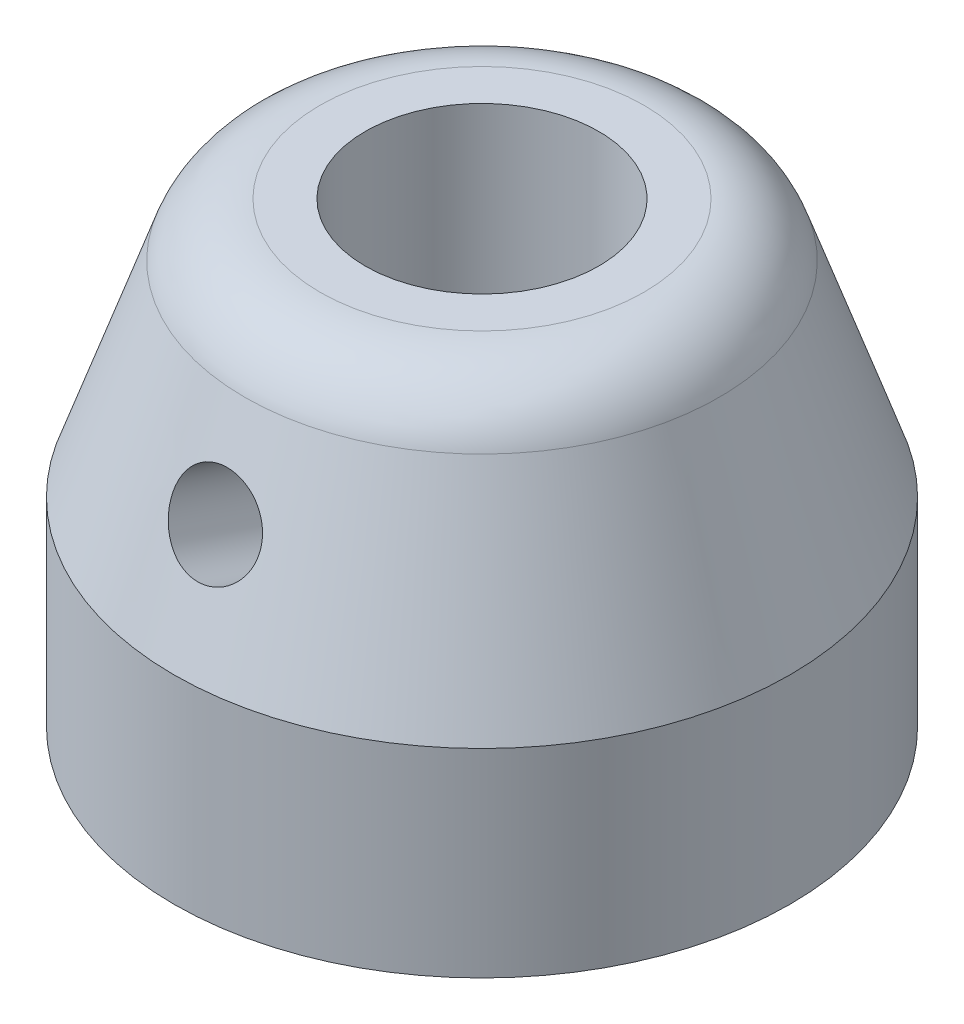
ISO-10303-21;
HEADER;
FILE_DESCRIPTION(('STEP AP214'),'2;1');
FILE_NAME('part.step','',(''),(''),'','','');
FILE_SCHEMA(('AUTOMOTIVE_DESIGN { 1 0 10303 214 1 1 1 1 }'));
ENDSEC;
DATA;
#1=APPLICATION_CONTEXT('core data for automotive mechanical design processes');
#2=APPLICATION_PROTOCOL_DEFINITION('international standard','automotive_design',2000,#1);
#3=PRODUCT_CONTEXT('',#1,'mechanical');
#4=PRODUCT('Part','Part','',(#3));
#5=PRODUCT_RELATED_PRODUCT_CATEGORY('part','',(#4));
#6=PRODUCT_DEFINITION_FORMATION('','',#4);
#7=PRODUCT_DEFINITION_CONTEXT('part definition',#1,'design');
#8=PRODUCT_DEFINITION('design','',#6,#7);
#9=PRODUCT_DEFINITION_SHAPE('','',#8);
#10=(LENGTH_UNIT() NAMED_UNIT(*) SI_UNIT(.MILLI.,.METRE.));
#11=(NAMED_UNIT(*) PLANE_ANGLE_UNIT() SI_UNIT($,.RADIAN.));
#12=(NAMED_UNIT(*) SI_UNIT($,.STERADIAN.) SOLID_ANGLE_UNIT());
#13=UNCERTAINTY_MEASURE_WITH_UNIT(LENGTH_MEASURE(1.E-05),#10,'distance_accuracy_value','');
#14=(GEOMETRIC_REPRESENTATION_CONTEXT(3) GLOBAL_UNCERTAINTY_ASSIGNED_CONTEXT((#13)) GLOBAL_UNIT_ASSIGNED_CONTEXT((#10,
#11,#12)) REPRESENTATION_CONTEXT('',''));
#15=CARTESIAN_POINT('',(0.,0.,0.));
#16=DIRECTION('',(0.,0.,1.));
#17=DIRECTION('',(1.,0.,0.));
#18=AXIS2_PLACEMENT_3D('',#15,#16,#17);
#19=CARTESIAN_POINT('',(0.,12.4784946236559,0.));
#20=DIRECTION('',(0.,-1.,0.));
#21=DIRECTION('',(0.,0.,-1.));
#22=AXIS2_PLACEMENT_3D('',#19,#20,#21);
#23=PLANE('',#22);
#24=CARTESIAN_POINT('',(0.,12.4784946236559,0.));
#25=DIRECTION('',(0.,-1.,0.));
#26=DIRECTION('',(0.,0.,-1.));
#27=AXIS2_PLACEMENT_3D('',#24,#25,#26);
#28=CIRCLE('',#27,16.303497543263);
#29=CARTESIAN_POINT('',(0.,12.4784946236559,-16.303497543263));
#30=VERTEX_POINT('',#29);
#31=EDGE_CURVE('E81',#30,#30,#28,.F.);
#32=ORIENTED_EDGE('',*,*,#31,.T.);
#33=EDGE_LOOP('',(#32));
#34=FACE_BOUND('',#33,.T.);
#35=CARTESIAN_POINT('',(0.,12.4784946236559,0.));
#36=DIRECTION('',(0.,1.,0.));
#37=DIRECTION('',(0.,0.,1.));
#38=AXIS2_PLACEMENT_3D('',#35,#36,#37);
#39=CIRCLE('',#38,11.75);
#40=CARTESIAN_POINT('',(0.,12.4784946236559,11.75));
#41=VERTEX_POINT('',#40);
#42=EDGE_CURVE('E67',#41,#41,#39,.T.);
#43=ORIENTED_EDGE('',*,*,#42,.F.);
#44=EDGE_LOOP('',(#43));
#45=FACE_BOUND('',#44,.T.);
#46=ADVANCED_FACE('F43',(#34,#45),#23,.F.);
#47=CARTESIAN_POINT('',(0.,-13.5215053763441,0.));
#48=DIRECTION('',(0.,-1.,0.));
#49=DIRECTION('',(0.,0.,-1.));
#50=AXIS2_PLACEMENT_3D('',#47,#48,#49);
#51=CONICAL_SURFACE('',#50,31.,0.333244301111673);
#52=CARTESIAN_POINT('',(-2.46260693911557,-5.94674350056082,28.2709140382285));
#53=CARTESIAN_POINT('',(-2.67471313879416,-5.82144101002906,28.2088981514728));
#54=CARTESIAN_POINT('',(-2.87511990771551,-5.67961052124816,28.139653644654));
#55=CARTESIAN_POINT('',(-3.24682694839401,-5.36641714070612,27.990062379626));
#56=CARTESIAN_POINT('',(-3.41809700150781,-5.19502395494744,27.9097042497804));
#57=CARTESIAN_POINT('',(-3.7265476148193,-4.82706365492553,27.741689719676));
#58=CARTESIAN_POINT('',(-3.86373834693528,-4.63050407887816,27.6540355075891));
#59=CARTESIAN_POINT('',(-4.1001235719692,-4.21718719265098,27.4753341055506));
#60=CARTESIAN_POINT('',(-4.19932748188149,-4.00043490486383,27.3842877626627));
#61=CARTESIAN_POINT('',(-4.35658939534579,-3.55311299536211,27.2029071214093));
#62=CARTESIAN_POINT('',(-4.41478192090339,-3.32259126382192,27.112571465285));
#63=CARTESIAN_POINT('',(-4.48875790743902,-2.85339406678989,26.9357835107167));
#64=CARTESIAN_POINT('',(-4.50454315351323,-2.61471894493599,26.8493310489639));
#65=CARTESIAN_POINT('',(-4.49326402326905,-2.13861034669539,26.6841084748828));
#66=CARTESIAN_POINT('',(-4.46665801748936,-1.90119106439454,26.6052658280715));
#67=CARTESIAN_POINT('',(-4.37225783692611,-1.43187896990972,26.4562976625441));
#68=CARTESIAN_POINT('',(-4.30446402777989,-1.19998610868492,26.3861720664506));
#69=CARTESIAN_POINT('',(-4.12982781060827,-0.748786964826126,26.2559739203233));
#70=CARTESIAN_POINT('',(-4.0230353740883,-0.529464988542146,26.19588864794));
#71=CARTESIAN_POINT('',(-3.7734636081791,-0.10948642119806,26.0861187411154));
#72=CARTESIAN_POINT('',(-3.63068169787146,0.0911688297989491,26.0364348530582));
#73=CARTESIAN_POINT('',(-3.31137390327955,0.46992145651921,25.9468126045675));
#74=CARTESIAN_POINT('',(-3.13450160066254,0.647752997180959,25.9069848103832));
#75=CARTESIAN_POINT('',(-2.75289531122724,0.972834365426337,25.8371463270958));
#76=CARTESIAN_POINT('',(-2.54816014879519,1.12008290196295,25.807136052404));
#77=CARTESIAN_POINT('',(-2.115164419278,1.38004935282548,25.755947118353));
#78=CARTESIAN_POINT('',(-1.88677389596489,1.49256135713591,25.7348208638967));
#79=CARTESIAN_POINT('',(-1.41389232954915,1.67805506708288,25.700821490246));
#80=CARTESIAN_POINT('',(-1.16940242896434,1.75103957446719,25.6879477860909));
#81=CARTESIAN_POINT('',(-0.67363530791894,1.85441452499354,25.6699091230474));
#82=CARTESIAN_POINT('',(-0.422440558884942,1.88518822013126,25.6646747745649));
#83=CARTESIAN_POINT('',(0.0815952279693475,1.90427209331273,25.6614150523405));
#84=CARTESIAN_POINT('',(0.334436163146998,1.89258489403183,25.6633892333506));
#85=CARTESIAN_POINT('',(0.832068477561531,1.82749079551801,25.6745991400029));
#86=CARTESIAN_POINT('',(1.0769134141751,1.77448006963987,25.683765914866));
#87=CARTESIAN_POINT('',(1.55418468328266,1.62907506077699,25.7097325379822));
#88=CARTESIAN_POINT('',(1.78661051203544,1.53667918162265,25.7265326955967));
#89=CARTESIAN_POINT('',(2.23394504066277,1.31496727768588,25.7685999346819));
#90=CARTESIAN_POINT('',(2.44874677282514,1.1854445775633,25.7939145546905));
#91=CARTESIAN_POINT('',(2.85354577840605,0.893859565880229,25.8538238887858));
#92=CARTESIAN_POINT('',(3.04354114409895,0.731794754108667,25.8884193159859));
#93=CARTESIAN_POINT('',(3.39562901242977,0.378068856215888,25.9680993309045));
#94=CARTESIAN_POINT('',(3.55737219531523,0.186086196174125,26.0133009619365));
#95=CARTESIAN_POINT('',(3.84566752768857,-0.220195453566362,26.1144080227888));
#96=CARTESIAN_POINT('',(3.97222006536443,-0.434494197060545,26.1703133345254));
#97=CARTESIAN_POINT('',(4.1863374358716,-0.878700586030969,26.2926294149973));
#98=CARTESIAN_POINT('',(4.27394358739701,-1.10859138972294,26.3590289483861));
#99=CARTESIAN_POINT('',(4.40770820599502,-1.57726850664151,26.5014690046821));
#100=CARTESIAN_POINT('',(4.453869947519,-1.81605411555207,26.5775087653898));
#101=CARTESIAN_POINT('',(4.50304708252596,-2.29268441493674,26.7365460278539));
#102=CARTESIAN_POINT('',(4.50654773870063,-2.53050886413842,26.8194544544453));
#103=CARTESIAN_POINT('',(4.4715667248051,-3.00114627076635,26.9904550090351));
#104=CARTESIAN_POINT('',(4.43308575443906,-3.23395931165135,27.0785470506154));
#105=CARTESIAN_POINT('',(4.31550938572784,-3.68748000312897,27.2564855664813));
#106=CARTESIAN_POINT('',(4.23654161671232,-3.90822329641135,27.346325679072));
#107=CARTESIAN_POINT('',(4.04037462809406,-4.3326715581963,27.5245006592055));
#108=CARTESIAN_POINT('',(3.92317311106358,-4.53637550189698,27.6128354359585));
#109=CARTESIAN_POINT('',(3.65255576646531,-4.92350313564158,27.7851004721415));
#110=CARTESIAN_POINT('',(3.498807758568,-5.10671668683345,27.8689811450507));
#111=CARTESIAN_POINT('',(3.1599753253891,-5.44611766188197,28.0276586185955));
#112=CARTESIAN_POINT('',(2.97488932254719,-5.60230372436923,28.1024549615986));
#113=CARTESIAN_POINT('',(2.57697256340037,-5.88487502549852,28.2399604168169));
#114=CARTESIAN_POINT('',(2.36394631023281,-6.0110307730023,28.3025758182732));
#115=CARTESIAN_POINT('',(1.91718805982549,-6.22884590753062,28.4119096342992));
#116=CARTESIAN_POINT('',(1.68345734678565,-6.32050743222075,28.458629033954));
#117=CARTESIAN_POINT('',(1.20315007594065,-6.46659414477394,28.5335778925606));
#118=CARTESIAN_POINT('',(0.956645143294297,-6.52120693014459,28.5619004729027));
#119=CARTESIAN_POINT('',(0.456724574508727,-6.5925035832146,28.5989477242252));
#120=CARTESIAN_POINT('',(0.203308064584295,-6.60918263249684,28.607669905523));
#121=CARTESIAN_POINT('',(-0.300733565325073,-6.60418277936417,28.6050622564529));
#122=CARTESIAN_POINT('',(-0.551363287712431,-6.58284760488236,28.5939121131327));
#123=CARTESIAN_POINT('',(-1.04484420914491,-6.50304948328179,28.5524911062393));
#124=CARTESIAN_POINT('',(-1.28770246371461,-6.44462127798724,28.5222381347704));
#125=CARTESIAN_POINT('',(-1.68834746573237,-6.31508417497577,28.4559150333033));
#126=CARTESIAN_POINT('',(-1.84986370974509,-6.25298647504618,28.4242869370323));
#127=CARTESIAN_POINT('',(-2.16365395981802,-6.11214176606818,28.3532295654693));
#128=CARTESIAN_POINT('',(-2.31592791059174,-6.03339465743726,28.313800243517));
#129=CARTESIAN_POINT('',(-2.46260693911557,-5.94674350056082,28.2709140382285));
#130=B_SPLINE_CURVE_WITH_KNOTS('',3,(#52,#53,#54,#55,#56,#57,#58,#59,#60,#61,#62,#63,#64,#65,
#66,#67,#68,#69,#70,#71,#72,#73,#74,#75,#76,#77,#78,#79,#80,#81,#82,#83,#84,#85,#86,#87,#88,#89,
#90,#91,#92,#93,#94,#95,#96,#97,#98,#99,#100,#101,#102,#103,#104,#105,#106,#107,#108,#109,#110,
#111,#112,#113,#114,#115,#116,#117,#118,#119,#120,#121,#122,#123,#124,#125,#126,#127,#128,#129),
.UNSPECIFIED.,.T.,.F.,(4,2,2,2,2,2,2,2,2,2,2,2,2,2,2,2,2,2,2,2,2,2,2,2,2,2,2,2,2,2,2,2,2,2,2,2,
2,2,4),(0.,0.761478533373102,1.52374206908933,2.28577781199907,3.04762452253207,
3.80696050970644,4.56626453281679,5.31741387391343,6.06855654691373,6.81874008940666,
7.56897744523579,8.32728403137302,9.08562262255965,9.84837378467347,10.6110708751584,
11.3667961869343,12.1224748207381,12.8709964629822,13.61954844359,14.3723511524082,
15.1252117212189,15.8868073544659,16.648394586219,17.4091719013244,18.169889103435,
18.921945089821,19.6739885419459,20.4236757202706,21.1734079548495,21.9302344537694,
22.6870990628048,23.4495741867771,24.2120020510866,24.9705399306456,25.7291741557853,
26.4809835160322,27.2320897584457,27.7586762685043,28.2852659282415),.UNSPECIFIED.);
#131=CARTESIAN_POINT('',(-2.46260693911557,-5.94674350056082,28.2709140382285));
#132=VERTEX_POINT('',#131);
#133=EDGE_CURVE('E11',#132,#132,#130,.T.);
#134=ORIENTED_EDGE('',*,*,#133,.T.);
#135=EDGE_LOOP('',(#134));
#136=FACE_BOUND('',#135,.T.);
#137=CARTESIAN_POINT('',(0.,7.09537913472125,0.));
#138=DIRECTION('',(0.,1.,0.));
#139=DIRECTION('',(0.,0.,1.));
#140=AXIS2_PLACEMENT_3D('',#137,#138,#139);
#141=CIRCLE('',#140,23.8633861307851);
#142=CARTESIAN_POINT('',(0.,7.09537913472125,23.8633861307851));
#143=VERTEX_POINT('',#142);
#144=EDGE_CURVE('E55',#143,#143,#141,.F.);
#145=ORIENTED_EDGE('',*,*,#144,.T.);
#146=EDGE_LOOP('',(#145));
#147=FACE_BOUND('',#146,.T.);
#148=CARTESIAN_POINT('',(0.,-13.5215053763441,0.));
#149=DIRECTION('',(0.,1.,0.));
#150=DIRECTION('',(0.,0.,1.));
#151=AXIS2_PLACEMENT_3D('',#148,#149,#150);
#152=CIRCLE('',#151,31.);
#153=CARTESIAN_POINT('',(0.,-13.5215053763441,31.));
#154=VERTEX_POINT('',#153);
#155=EDGE_CURVE('E78',#154,#154,#152,.T.);
#156=ORIENTED_EDGE('',*,*,#155,.T.);
#157=EDGE_LOOP('',(#156));
#158=FACE_BOUND('',#157,.T.);
#159=ADVANCED_FACE('F86',(#136,#147,#158),#51,.T.);
#160=CARTESIAN_POINT('',(0.,17.6827956989247,0.));
#161=DIRECTION('',(0.,1.,0.));
#162=DIRECTION('',(0.,0.,1.));
#163=AXIS2_PLACEMENT_3D('',#160,#161,#162);
#164=CYLINDRICAL_SURFACE('',#163,31.);
#165=ORIENTED_EDGE('',*,*,#155,.F.);
#166=EDGE_LOOP('',(#165));
#167=FACE_BOUND('',#166,.T.);
#168=CARTESIAN_POINT('',(0.,-33.5215053763441,0.));
#169=DIRECTION('',(0.,1.,0.));
#170=DIRECTION('',(0.,0.,1.));
#171=AXIS2_PLACEMENT_3D('',#168,#169,#170);
#172=CIRCLE('',#171,31.);
#173=CARTESIAN_POINT('',(0.,-33.5215053763441,31.));
#174=VERTEX_POINT('',#173);
#175=EDGE_CURVE('E75',#174,#174,#172,.T.);
#176=ORIENTED_EDGE('',*,*,#175,.T.);
#177=EDGE_LOOP('',(#176));
#178=FACE_BOUND('',#177,.T.);
#179=ADVANCED_FACE('F105',(#167,#178),#164,.T.);
#180=CARTESIAN_POINT('',(31.,-33.5215053763441,0.));
#181=DIRECTION('',(0.,1.,0.));
#182=DIRECTION('',(0.,0.,1.));
#183=AXIS2_PLACEMENT_3D('',#180,#181,#182);
#184=PLANE('',#183);
#185=CARTESIAN_POINT('',(0.,-33.5215053763441,0.));
#186=DIRECTION('',(0.,1.,0.));
#187=DIRECTION('',(0.,0.,1.));
#188=AXIS2_PLACEMENT_3D('',#185,#186,#187);
#189=CIRCLE('',#188,11.75);
#190=CARTESIAN_POINT('',(0.,-33.5215053763441,11.75));
#191=VERTEX_POINT('',#190);
#192=EDGE_CURVE('E70',#191,#191,#189,.T.);
#193=ORIENTED_EDGE('',*,*,#192,.T.);
#194=EDGE_LOOP('',(#193));
#195=FACE_BOUND('',#194,.T.);
#196=ORIENTED_EDGE('',*,*,#175,.F.);
#197=EDGE_LOOP('',(#196));
#198=FACE_BOUND('',#197,.T.);
#199=ADVANCED_FACE('F99',(#195,#198),#184,.F.);
#200=CARTESIAN_POINT('',(0.,12.4784946236559,0.));
#201=DIRECTION('',(0.,1.,0.));
#202=DIRECTION('',(0.,0.,1.));
#203=AXIS2_PLACEMENT_3D('',#200,#201,#202);
#204=CYLINDRICAL_SURFACE('',#203,11.75);
#205=ORIENTED_EDGE('',*,*,#192,.F.);
#206=EDGE_LOOP('',(#205));
#207=FACE_BOUND('',#206,.T.);
#208=ORIENTED_EDGE('',*,*,#42,.T.);
#209=EDGE_LOOP('',(#208));
#210=FACE_BOUND('',#209,.T.);
#211=ADVANCED_FACE('F91',(#207,#210),#204,.F.);
#212=CARTESIAN_POINT('',(0.,4.47849462365591,0.));
#213=DIRECTION('',(0.,-1.,0.));
#214=DIRECTION('',(0.,0.,-1.));
#215=AXIS2_PLACEMENT_3D('',#212,#213,#214);
#216=TOROIDAL_SURFACE('',#215,16.303497543263,8.);
#217=ORIENTED_EDGE('',*,*,#144,.F.);
#218=EDGE_LOOP('',(#217));
#219=FACE_BOUND('',#218,.T.);
#220=ORIENTED_EDGE('',*,*,#31,.F.);
#221=EDGE_LOOP('',(#220));
#222=FACE_BOUND('',#221,.T.);
#223=ADVANCED_FACE('F45',(#219,#222),#216,.T.);
#224=CARTESIAN_POINT('',(0.,-2.35448159968133,27.1344917696167));
#225=DIRECTION('',(0.,0.327110563883167,0.944986073440258));
#226=DIRECTION('',(0.,-0.944986073440258,0.327110563883167));
#227=AXIS2_PLACEMENT_3D('',#224,#225,#226);
#228=CYLINDRICAL_SURFACE('',#227,4.5);
#229=CARTESIAN_POINT('',(0.,-5.625587238513,17.6846310352142));
#230=DIRECTION('',(0.,0.327110563883167,0.944986073440258));
#231=DIRECTION('',(0.,-0.944986073440258,0.327110563883167));
#232=AXIS2_PLACEMENT_3D('',#229,#230,#231);
#233=CIRCLE('',#232,4.5);
#234=CARTESIAN_POINT('',(0.,-9.87802456899416,19.1566285726884));
#235=VERTEX_POINT('',#234);
#236=EDGE_CURVE('E65',#235,#235,#233,.T.);
#237=ORIENTED_EDGE('',*,*,#236,.F.);
#238=EDGE_LOOP('',(#237));
#239=FACE_BOUND('',#238,.T.);
#240=ORIENTED_EDGE('',*,*,#133,.F.);
#241=EDGE_LOOP('',(#240));
#242=FACE_BOUND('',#241,.T.);
#243=ADVANCED_FACE('F61',(#239,#242),#228,.F.);
#244=CARTESIAN_POINT('',(0.,-5.625587238513,17.6846310352142));
#245=DIRECTION('',(0.,0.327110563883167,0.944986073440258));
#246=DIRECTION('',(0.,-0.944986073440258,0.327110563883167));
#247=AXIS2_PLACEMENT_3D('',#244,#245,#246);
#248=CONICAL_SURFACE('',#247,4.5,1.02974425867665);
#249=CARTESIAN_POINT('',(0.,-6.51005259008682,15.1295089084453));
#250=VERTEX_POINT('',#249);
#251=VERTEX_LOOP('',#250);
#252=FACE_BOUND('',#251,.T.);
#253=ORIENTED_EDGE('',*,*,#236,.T.);
#254=EDGE_LOOP('',(#253));
#255=FACE_BOUND('',#254,.T.);
#256=ADVANCED_FACE('F58',(#252,#255),#248,.F.);
#257=CLOSED_SHELL('',(#46,#159,#179,#199,#211,#223,#243,#256));
#258=MANIFOLD_SOLID_BREP('B2',#257);
#259=ADVANCED_BREP_SHAPE_REPRESENTATION('',(#18,#258),#14);
#260=SHAPE_DEFINITION_REPRESENTATION(#9,#259);
ENDSEC;
END-ISO-10303-21;
